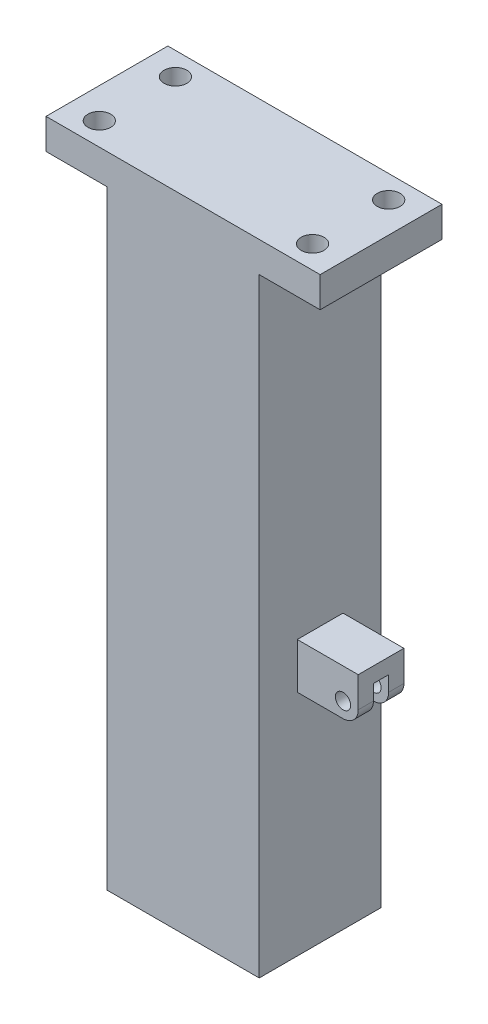
ISO-10303-21;
HEADER;
FILE_DESCRIPTION(('STEP AP214'),'2;1');
FILE_NAME('part.step','',(''),(''),'','','');
FILE_SCHEMA(('AUTOMOTIVE_DESIGN { 1 0 10303 214 1 1 1 1 }'));
ENDSEC;
DATA;
#1=APPLICATION_CONTEXT('core data for automotive mechanical design processes');
#2=APPLICATION_PROTOCOL_DEFINITION('international standard','automotive_design',2000,#1);
#3=PRODUCT_CONTEXT('',#1,'mechanical');
#4=PRODUCT('Part','Part','',(#3));
#5=PRODUCT_RELATED_PRODUCT_CATEGORY('part','',(#4));
#6=PRODUCT_DEFINITION_FORMATION('','',#4);
#7=PRODUCT_DEFINITION_CONTEXT('part definition',#1,'design');
#8=PRODUCT_DEFINITION('design','',#6,#7);
#9=PRODUCT_DEFINITION_SHAPE('','',#8);
#10=(LENGTH_UNIT() NAMED_UNIT(*) SI_UNIT(.MILLI.,.METRE.));
#11=(NAMED_UNIT(*) PLANE_ANGLE_UNIT() SI_UNIT($,.RADIAN.));
#12=(NAMED_UNIT(*) SI_UNIT($,.STERADIAN.) SOLID_ANGLE_UNIT());
#13=UNCERTAINTY_MEASURE_WITH_UNIT(LENGTH_MEASURE(1.E-05),#10,'distance_accuracy_value','');
#14=(GEOMETRIC_REPRESENTATION_CONTEXT(3) GLOBAL_UNCERTAINTY_ASSIGNED_CONTEXT((#13)) GLOBAL_UNIT_ASSIGNED_CONTEXT((#10,
#11,#12)) REPRESENTATION_CONTEXT('',''));
#15=CARTESIAN_POINT('',(0.,0.,0.));
#16=DIRECTION('',(0.,0.,1.));
#17=DIRECTION('',(1.,0.,0.));
#18=AXIS2_PLACEMENT_3D('',#15,#16,#17);
#19=CARTESIAN_POINT('',(-9.99999999999998,-240.,-55.));
#20=DIRECTION('',(0.,0.,1.));
#21=DIRECTION('',(1.,0.,0.));
#22=AXIS2_PLACEMENT_3D('',#19,#20,#21);
#23=CYLINDRICAL_SURFACE('',#22,5.);
#24=CARTESIAN_POINT('',(-9.99999999999998,-240.,-35.));
#25=DIRECTION('',(0.,0.,1.));
#26=DIRECTION('',(1.,0.,0.));
#27=AXIS2_PLACEMENT_3D('',#24,#25,#26);
#28=CIRCLE('',#27,5.);
#29=CARTESIAN_POINT('',(-4.99999999999998,-240.,-35.));
#30=VERTEX_POINT('',#29);
#31=EDGE_CURVE('E233',#30,#30,#28,.F.);
#32=ORIENTED_EDGE('',*,*,#31,.T.);
#33=EDGE_LOOP('',(#32));
#34=FACE_BOUND('',#33,.T.);
#35=CARTESIAN_POINT('',(-9.99999999999998,-240.,-25.));
#36=DIRECTION('',(0.,0.,1.));
#37=DIRECTION('',(1.,0.,0.));
#38=AXIS2_PLACEMENT_3D('',#35,#36,#37);
#39=CIRCLE('',#38,5.);
#40=CARTESIAN_POINT('',(-4.99999999999998,-240.,-25.));
#41=VERTEX_POINT('',#40);
#42=EDGE_CURVE('E229',#41,#41,#39,.T.);
#43=ORIENTED_EDGE('',*,*,#42,.T.);
#44=EDGE_LOOP('',(#43));
#45=FACE_BOUND('',#44,.T.);
#46=ADVANCED_FACE('F45',(#34,#45),#23,.F.);
#47=CARTESIAN_POINT('',(-40.,-400.,0.));
#48=DIRECTION('',(-1.,0.,0.));
#49=DIRECTION('',(0.,0.,1.));
#50=AXIS2_PLACEMENT_3D('',#47,#48,#49);
#51=PLANE('',#50);
#52=DIRECTION('',(0.,0.,1.));
#53=VECTOR('',#52,1.);
#54=CARTESIAN_POINT('',(-40.,0.,0.));
#55=LINE('',#54,#53);
#56=CARTESIAN_POINT('',(-40.,0.,-80.));
#57=VERTEX_POINT('',#56);
#58=CARTESIAN_POINT('',(-40.,0.,0.));
#59=VERTEX_POINT('',#58);
#60=EDGE_CURVE('E311',#57,#59,#55,.T.);
#61=ORIENTED_EDGE('',*,*,#60,.T.);
#62=DIRECTION('',(0.,1.,0.));
#63=VECTOR('',#62,1.);
#64=CARTESIAN_POINT('',(-40.,-400.,0.));
#65=LINE('',#64,#63);
#66=CARTESIAN_POINT('',(-40.,-400.,0.));
#67=VERTEX_POINT('',#66);
#68=EDGE_CURVE('E330',#67,#59,#65,.T.);
#69=ORIENTED_EDGE('',*,*,#68,.F.);
#70=DIRECTION('',(0.,0.,1.));
#71=VECTOR('',#70,1.);
#72=CARTESIAN_POINT('',(-40.,-400.,0.));
#73=LINE('',#72,#71);
#74=CARTESIAN_POINT('',(-40.,-400.,-80.));
#75=VERTEX_POINT('',#74);
#76=EDGE_CURVE('E314',#75,#67,#73,.T.);
#77=ORIENTED_EDGE('',*,*,#76,.F.);
#78=DIRECTION('',(0.,1.,0.));
#79=VECTOR('',#78,1.);
#80=CARTESIAN_POINT('',(-40.,-400.,-80.));
#81=LINE('',#80,#79);
#82=EDGE_CURVE('E334',#75,#57,#81,.T.);
#83=ORIENTED_EDGE('',*,*,#82,.T.);
#84=EDGE_LOOP('',(#61,#69,#77,#83));
#85=FACE_BOUND('',#84,.T.);
#86=DIRECTION('',(0.,-1.,0.));
#87=VECTOR('',#86,1.);
#88=CARTESIAN_POINT('',(-40.,-220.,-25.));
#89=LINE('',#88,#87);
#90=CARTESIAN_POINT('',(-40.,-220.,-25.));
#91=VERTEX_POINT('',#90);
#92=CARTESIAN_POINT('',(-40.,-250.,-25.));
#93=VERTEX_POINT('',#92);
#94=EDGE_CURVE('E228',#91,#93,#89,.T.);
#95=ORIENTED_EDGE('',*,*,#94,.F.);
#96=DIRECTION('',(0.,0.,1.));
#97=VECTOR('',#96,1.);
#98=CARTESIAN_POINT('',(-40.,-220.,-25.));
#99=LINE('',#98,#97);
#100=CARTESIAN_POINT('',(-40.,-220.,-55.));
#101=VERTEX_POINT('',#100);
#102=EDGE_CURVE('E239',#101,#91,#99,.T.);
#103=ORIENTED_EDGE('',*,*,#102,.F.);
#104=DIRECTION('',(0.,1.,0.));
#105=VECTOR('',#104,1.);
#106=CARTESIAN_POINT('',(-40.,-220.,-55.));
#107=LINE('',#106,#105);
#108=CARTESIAN_POINT('',(-40.,-250.,-55.));
#109=VERTEX_POINT('',#108);
#110=EDGE_CURVE('E253',#109,#101,#107,.T.);
#111=ORIENTED_EDGE('',*,*,#110,.F.);
#112=DIRECTION('',(0.,0.,-1.));
#113=VECTOR('',#112,1.);
#114=CARTESIAN_POINT('',(-40.,-250.,-25.));
#115=LINE('',#114,#113);
#116=EDGE_CURVE('E249',#93,#109,#115,.T.);
#117=ORIENTED_EDGE('',*,*,#116,.F.);
#118=EDGE_LOOP('',(#95,#103,#111,#117));
#119=FACE_BOUND('',#118,.T.);
#120=ADVANCED_FACE('F485',(#85,#119),#51,.F.);
#121=CARTESIAN_POINT('',(0.,0.,0.));
#122=DIRECTION('',(0.,1.,0.));
#123=DIRECTION('',(0.,0.,1.));
#124=AXIS2_PLACEMENT_3D('',#121,#122,#123);
#125=PLANE('',#124);
#126=CARTESIAN_POINT('',(-160.,0.,-65.));
#127=DIRECTION('',(0.,1.,0.));
#128=DIRECTION('',(0.,0.,1.));
#129=AXIS2_PLACEMENT_3D('',#126,#127,#128);
#130=CIRCLE('',#129,7.50000000000001);
#131=CARTESIAN_POINT('',(-160.,0.,-57.5));
#132=VERTEX_POINT('',#131);
#133=EDGE_CURVE('E367',#132,#132,#130,.T.);
#134=ORIENTED_EDGE('',*,*,#133,.T.);
#135=EDGE_LOOP('',(#134));
#136=FACE_BOUND('',#135,.T.);
#137=CARTESIAN_POINT('',(-160.,0.,-15.));
#138=DIRECTION('',(0.,1.,0.));
#139=DIRECTION('',(0.,0.,1.));
#140=AXIS2_PLACEMENT_3D('',#137,#138,#139);
#141=CIRCLE('',#140,7.50000000000001);
#142=CARTESIAN_POINT('',(-160.,0.,-7.49999999999997));
#143=VERTEX_POINT('',#142);
#144=EDGE_CURVE('E356',#143,#143,#141,.T.);
#145=ORIENTED_EDGE('',*,*,#144,.T.);
#146=EDGE_LOOP('',(#145));
#147=FACE_BOUND('',#146,.T.);
#148=DIRECTION('',(0.,0.,-1.));
#149=VECTOR('',#148,1.);
#150=CARTESIAN_POINT('',(-140.,0.,0.));
#151=LINE('',#150,#149);
#152=CARTESIAN_POINT('',(-140.,0.,0.));
#153=VERTEX_POINT('',#152);
#154=CARTESIAN_POINT('',(-140.,0.,-80.));
#155=VERTEX_POINT('',#154);
#156=EDGE_CURVE('E302',#153,#155,#151,.T.);
#157=ORIENTED_EDGE('',*,*,#156,.F.);
#158=DIRECTION('',(1.,0.,0.));
#159=VECTOR('',#158,1.);
#160=CARTESIAN_POINT('',(0.,0.,0.));
#161=LINE('',#160,#159);
#162=CARTESIAN_POINT('',(-180.,0.,0.));
#163=VERTEX_POINT('',#162);
#164=EDGE_CURVE('E380',#163,#153,#161,.T.);
#165=ORIENTED_EDGE('',*,*,#164,.F.);
#166=DIRECTION('',(0.,0.,1.));
#167=VECTOR('',#166,1.);
#168=CARTESIAN_POINT('',(-180.,0.,0.));
#169=LINE('',#168,#167);
#170=CARTESIAN_POINT('',(-180.,0.,-80.));
#171=VERTEX_POINT('',#170);
#172=EDGE_CURVE('E398',#171,#163,#169,.T.);
#173=ORIENTED_EDGE('',*,*,#172,.F.);
#174=DIRECTION('',(-1.,0.,0.));
#175=VECTOR('',#174,1.);
#176=CARTESIAN_POINT('',(0.,0.,-80.));
#177=LINE('',#176,#175);
#178=EDGE_CURVE('E393',#155,#171,#177,.T.);
#179=ORIENTED_EDGE('',*,*,#178,.F.);
#180=EDGE_LOOP('',(#157,#165,#173,#179));
#181=FACE_BOUND('',#180,.T.);
#182=ADVANCED_FACE('F469',(#136,#147,#181),#125,.F.);
#183=CARTESIAN_POINT('',(-20.,0.,-15.));
#184=DIRECTION('',(0.,1.,0.));
#185=DIRECTION('',(0.,0.,1.));
#186=AXIS2_PLACEMENT_3D('',#183,#184,#185);
#187=CIRCLE('',#186,7.5);
#188=CARTESIAN_POINT('',(-20.,0.,-7.49999999999999));
#189=VERTEX_POINT('',#188);
#190=EDGE_CURVE('E342',#189,#189,#187,.T.);
#191=ORIENTED_EDGE('',*,*,#190,.T.);
#192=EDGE_LOOP('',(#191));
#193=FACE_BOUND('',#192,.T.);
#194=CARTESIAN_POINT('',(-20.,0.,-65.));
#195=DIRECTION('',(0.,1.,0.));
#196=DIRECTION('',(0.,0.,1.));
#197=AXIS2_PLACEMENT_3D('',#194,#195,#196);
#198=CIRCLE('',#197,7.5);
#199=CARTESIAN_POINT('',(-20.,0.,-57.5));
#200=VERTEX_POINT('',#199);
#201=EDGE_CURVE('E347',#200,#200,#198,.T.);
#202=ORIENTED_EDGE('',*,*,#201,.T.);
#203=EDGE_LOOP('',(#202));
#204=FACE_BOUND('',#203,.T.);
#205=ORIENTED_EDGE('',*,*,#60,.F.);
#206=CARTESIAN_POINT('',(0.,0.,-80.));
#207=VERTEX_POINT('',#206);
#208=EDGE_CURVE('E394',#207,#57,#177,.T.);
#209=ORIENTED_EDGE('',*,*,#208,.F.);
#210=DIRECTION('',(0.,0.,-1.));
#211=VECTOR('',#210,1.);
#212=CARTESIAN_POINT('',(0.,0.,0.));
#213=LINE('',#212,#211);
#214=CARTESIAN_POINT('',(0.,0.,0.));
#215=VERTEX_POINT('',#214);
#216=EDGE_CURVE('E371',#215,#207,#213,.T.);
#217=ORIENTED_EDGE('',*,*,#216,.F.);
#218=EDGE_CURVE('E401',#59,#215,#161,.T.);
#219=ORIENTED_EDGE('',*,*,#218,.F.);
#220=EDGE_LOOP('',(#205,#209,#217,#219));
#221=FACE_BOUND('',#220,.T.);
#222=ADVANCED_FACE('F488',(#193,#204,#221),#125,.F.);
#223=CARTESIAN_POINT('',(0.,20.,0.));
#224=DIRECTION('',(-1.,0.,0.));
#225=DIRECTION('',(0.,0.,1.));
#226=AXIS2_PLACEMENT_3D('',#223,#224,#225);
#227=PLANE('',#226);
#228=ORIENTED_EDGE('',*,*,#216,.T.);
#229=DIRECTION('',(0.,-1.,0.));
#230=VECTOR('',#229,1.);
#231=CARTESIAN_POINT('',(0.,20.,-80.));
#232=LINE('',#231,#230);
#233=CARTESIAN_POINT('',(0.,20.,-80.));
#234=VERTEX_POINT('',#233);
#235=EDGE_CURVE('E416',#234,#207,#232,.T.);
#236=ORIENTED_EDGE('',*,*,#235,.F.);
#237=DIRECTION('',(0.,0.,-1.));
#238=VECTOR('',#237,1.);
#239=CARTESIAN_POINT('',(0.,20.,0.));
#240=LINE('',#239,#238);
#241=CARTESIAN_POINT('',(0.,20.,0.));
#242=VERTEX_POINT('',#241);
#243=EDGE_CURVE('E375',#242,#234,#240,.T.);
#244=ORIENTED_EDGE('',*,*,#243,.F.);
#245=DIRECTION('',(0.,-1.,0.));
#246=VECTOR('',#245,1.);
#247=CARTESIAN_POINT('',(0.,20.,0.));
#248=LINE('',#247,#246);
#249=EDGE_CURVE('E389',#242,#215,#248,.T.);
#250=ORIENTED_EDGE('',*,*,#249,.T.);
#251=EDGE_LOOP('',(#228,#236,#244,#250));
#252=FACE_BOUND('',#251,.T.);
#253=ADVANCED_FACE('F493',(#252),#227,.F.);
#254=CARTESIAN_POINT('',(0.,20.,-80.));
#255=DIRECTION('',(0.,0.,1.));
#256=DIRECTION('',(1.,0.,0.));
#257=AXIS2_PLACEMENT_3D('',#254,#255,#256);
#258=PLANE('',#257);
#259=ORIENTED_EDGE('',*,*,#208,.T.);
#260=ORIENTED_EDGE('',*,*,#82,.F.);
#261=DIRECTION('',(1.,0.,0.));
#262=VECTOR('',#261,1.);
#263=CARTESIAN_POINT('',(-140.,-400.,-80.));
#264=LINE('',#263,#262);
#265=CARTESIAN_POINT('',(-140.,-400.,-80.));
#266=VERTEX_POINT('',#265);
#267=EDGE_CURVE('E310',#266,#75,#264,.T.);
#268=ORIENTED_EDGE('',*,*,#267,.F.);
#269=DIRECTION('',(0.,1.,0.));
#270=VECTOR('',#269,1.);
#271=CARTESIAN_POINT('',(-140.,-400.,-80.));
#272=LINE('',#271,#270);
#273=EDGE_CURVE('E338',#266,#155,#272,.T.);
#274=ORIENTED_EDGE('',*,*,#273,.T.);
#275=ORIENTED_EDGE('',*,*,#178,.T.);
#276=DIRECTION('',(0.,-1.,0.));
#277=VECTOR('',#276,1.);
#278=CARTESIAN_POINT('',(-180.,20.,-80.));
#279=LINE('',#278,#277);
#280=CARTESIAN_POINT('',(-180.,20.,-80.));
#281=VERTEX_POINT('',#280);
#282=EDGE_CURVE('E412',#281,#171,#279,.T.);
#283=ORIENTED_EDGE('',*,*,#282,.F.);
#284=DIRECTION('',(-1.,0.,0.));
#285=VECTOR('',#284,1.);
#286=CARTESIAN_POINT('',(0.,20.,-80.));
#287=LINE('',#286,#285);
#288=EDGE_CURVE('E379',#234,#281,#287,.T.);
#289=ORIENTED_EDGE('',*,*,#288,.F.);
#290=ORIENTED_EDGE('',*,*,#235,.T.);
#291=EDGE_LOOP('',(#259,#260,#268,#274,#275,#283,#289,#290));
#292=FACE_BOUND('',#291,.T.);
#293=ADVANCED_FACE('F460',(#292),#258,.F.);
#294=CARTESIAN_POINT('',(-180.,20.,0.));
#295=DIRECTION('',(1.,0.,0.));
#296=DIRECTION('',(0.,0.,-1.));
#297=AXIS2_PLACEMENT_3D('',#294,#295,#296);
#298=PLANE('',#297);
#299=ORIENTED_EDGE('',*,*,#172,.T.);
#300=DIRECTION('',(0.,-1.,0.));
#301=VECTOR('',#300,1.);
#302=CARTESIAN_POINT('',(-180.,20.,0.));
#303=LINE('',#302,#301);
#304=CARTESIAN_POINT('',(-180.,20.,0.));
#305=VERTEX_POINT('',#304);
#306=EDGE_CURVE('E408',#305,#163,#303,.T.);
#307=ORIENTED_EDGE('',*,*,#306,.F.);
#308=DIRECTION('',(0.,0.,1.));
#309=VECTOR('',#308,1.);
#310=CARTESIAN_POINT('',(-180.,20.,0.));
#311=LINE('',#310,#309);
#312=EDGE_CURVE('E383',#281,#305,#311,.T.);
#313=ORIENTED_EDGE('',*,*,#312,.F.);
#314=ORIENTED_EDGE('',*,*,#282,.T.);
#315=EDGE_LOOP('',(#299,#307,#313,#314));
#316=FACE_BOUND('',#315,.T.);
#317=ADVANCED_FACE('F466',(#316),#298,.F.);
#318=CARTESIAN_POINT('',(0.,20.,0.));
#319=DIRECTION('',(0.,0.,-1.));
#320=DIRECTION('',(-1.,0.,0.));
#321=AXIS2_PLACEMENT_3D('',#318,#319,#320);
#322=PLANE('',#321);
#323=ORIENTED_EDGE('',*,*,#164,.T.);
#324=DIRECTION('',(0.,1.,0.));
#325=VECTOR('',#324,1.);
#326=CARTESIAN_POINT('',(-140.,-400.,0.));
#327=LINE('',#326,#325);
#328=CARTESIAN_POINT('',(-140.,-400.,0.));
#329=VERTEX_POINT('',#328);
#330=EDGE_CURVE('E320',#329,#153,#327,.T.);
#331=ORIENTED_EDGE('',*,*,#330,.F.);
#332=DIRECTION('',(-1.,0.,0.));
#333=VECTOR('',#332,1.);
#334=CARTESIAN_POINT('',(-140.,-400.,0.));
#335=LINE('',#334,#333);
#336=EDGE_CURVE('E317',#67,#329,#335,.T.);
#337=ORIENTED_EDGE('',*,*,#336,.F.);
#338=ORIENTED_EDGE('',*,*,#68,.T.);
#339=ORIENTED_EDGE('',*,*,#218,.T.);
#340=ORIENTED_EDGE('',*,*,#249,.F.);
#341=DIRECTION('',(1.,0.,0.));
#342=VECTOR('',#341,1.);
#343=CARTESIAN_POINT('',(0.,20.,0.));
#344=LINE('',#343,#342);
#345=EDGE_CURVE('E386',#305,#242,#344,.T.);
#346=ORIENTED_EDGE('',*,*,#345,.F.);
#347=ORIENTED_EDGE('',*,*,#306,.T.);
#348=EDGE_LOOP('',(#323,#331,#337,#338,#339,#340,#346,#347));
#349=FACE_BOUND('',#348,.T.);
#350=ADVANCED_FACE('F472',(#349),#322,.F.);
#351=CARTESIAN_POINT('',(0.,20.,0.));
#352=DIRECTION('',(0.,1.,0.));
#353=DIRECTION('',(0.,0.,1.));
#354=AXIS2_PLACEMENT_3D('',#351,#352,#353);
#355=PLANE('',#354);
#356=CARTESIAN_POINT('',(-160.,20.,-15.));
#357=DIRECTION('',(0.,1.,0.));
#358=DIRECTION('',(0.,0.,1.));
#359=AXIS2_PLACEMENT_3D('',#356,#357,#358);
#360=CIRCLE('',#359,7.50000000000001);
#361=CARTESIAN_POINT('',(-160.,20.,-7.49999999999997));
#362=VERTEX_POINT('',#361);
#363=EDGE_CURVE('E351',#362,#362,#360,.T.);
#364=ORIENTED_EDGE('',*,*,#363,.F.);
#365=EDGE_LOOP('',(#364));
#366=FACE_BOUND('',#365,.T.);
#367=CARTESIAN_POINT('',(-20.,20.,-65.));
#368=DIRECTION('',(0.,1.,0.));
#369=DIRECTION('',(0.,0.,1.));
#370=AXIS2_PLACEMENT_3D('',#367,#368,#369);
#371=CIRCLE('',#370,7.5);
#372=CARTESIAN_POINT('',(-20.,20.,-57.5));
#373=VERTEX_POINT('',#372);
#374=EDGE_CURVE('E360',#373,#373,#371,.T.);
#375=ORIENTED_EDGE('',*,*,#374,.F.);
#376=EDGE_LOOP('',(#375));
#377=FACE_BOUND('',#376,.T.);
#378=CARTESIAN_POINT('',(-20.,20.,-15.));
#379=DIRECTION('',(0.,1.,0.));
#380=DIRECTION('',(0.,0.,1.));
#381=AXIS2_PLACEMENT_3D('',#378,#379,#380);
#382=CIRCLE('',#381,7.5);
#383=CARTESIAN_POINT('',(-20.,20.,-7.49999999999999));
#384=VERTEX_POINT('',#383);
#385=EDGE_CURVE('E343',#384,#384,#382,.T.);
#386=ORIENTED_EDGE('',*,*,#385,.F.);
#387=EDGE_LOOP('',(#386));
#388=FACE_BOUND('',#387,.T.);
#389=CARTESIAN_POINT('',(-160.,20.,-65.));
#390=DIRECTION('',(0.,1.,0.));
#391=DIRECTION('',(0.,0.,1.));
#392=AXIS2_PLACEMENT_3D('',#389,#390,#391);
#393=CIRCLE('',#392,7.50000000000001);
#394=CARTESIAN_POINT('',(-160.,20.,-57.5));
#395=VERTEX_POINT('',#394);
#396=EDGE_CURVE('E355',#395,#395,#393,.T.);
#397=ORIENTED_EDGE('',*,*,#396,.F.);
#398=EDGE_LOOP('',(#397));
#399=FACE_BOUND('',#398,.T.);
#400=ORIENTED_EDGE('',*,*,#243,.T.);
#401=ORIENTED_EDGE('',*,*,#288,.T.);
#402=ORIENTED_EDGE('',*,*,#312,.T.);
#403=ORIENTED_EDGE('',*,*,#345,.T.);
#404=EDGE_LOOP('',(#400,#401,#402,#403));
#405=FACE_BOUND('',#404,.T.);
#406=ADVANCED_FACE('F495',(#366,#377,#388,#399,#405),#355,.T.);
#407=CARTESIAN_POINT('',(-160.,0.,-65.));
#408=DIRECTION('',(0.,1.,0.));
#409=DIRECTION('',(0.,0.,1.));
#410=AXIS2_PLACEMENT_3D('',#407,#408,#409);
#411=CYLINDRICAL_SURFACE('',#410,7.50000000000001);
#412=ORIENTED_EDGE('',*,*,#133,.F.);
#413=EDGE_LOOP('',(#412));
#414=FACE_BOUND('',#413,.T.);
#415=ORIENTED_EDGE('',*,*,#396,.T.);
#416=EDGE_LOOP('',(#415));
#417=FACE_BOUND('',#416,.T.);
#418=ADVANCED_FACE('F497',(#414,#417),#411,.F.);
#419=CARTESIAN_POINT('',(-20.,0.,-15.));
#420=DIRECTION('',(0.,1.,0.));
#421=DIRECTION('',(0.,0.,1.));
#422=AXIS2_PLACEMENT_3D('',#419,#420,#421);
#423=CYLINDRICAL_SURFACE('',#422,7.5);
#424=ORIENTED_EDGE('',*,*,#190,.F.);
#425=EDGE_LOOP('',(#424));
#426=FACE_BOUND('',#425,.T.);
#427=ORIENTED_EDGE('',*,*,#385,.T.);
#428=EDGE_LOOP('',(#427));
#429=FACE_BOUND('',#428,.T.);
#430=ADVANCED_FACE('F504',(#426,#429),#423,.F.);
#431=CARTESIAN_POINT('',(-20.,0.,-65.));
#432=DIRECTION('',(0.,1.,0.));
#433=DIRECTION('',(0.,0.,1.));
#434=AXIS2_PLACEMENT_3D('',#431,#432,#433);
#435=CYLINDRICAL_SURFACE('',#434,7.5);
#436=ORIENTED_EDGE('',*,*,#201,.F.);
#437=EDGE_LOOP('',(#436));
#438=FACE_BOUND('',#437,.T.);
#439=ORIENTED_EDGE('',*,*,#374,.T.);
#440=EDGE_LOOP('',(#439));
#441=FACE_BOUND('',#440,.T.);
#442=ADVANCED_FACE('F620',(#438,#441),#435,.F.);
#443=CARTESIAN_POINT('',(-160.,0.,-15.));
#444=DIRECTION('',(0.,1.,0.));
#445=DIRECTION('',(0.,0.,1.));
#446=AXIS2_PLACEMENT_3D('',#443,#444,#445);
#447=CYLINDRICAL_SURFACE('',#446,7.50000000000001);
#448=ORIENTED_EDGE('',*,*,#144,.F.);
#449=EDGE_LOOP('',(#448));
#450=FACE_BOUND('',#449,.T.);
#451=ORIENTED_EDGE('',*,*,#363,.T.);
#452=EDGE_LOOP('',(#451));
#453=FACE_BOUND('',#452,.T.);
#454=ADVANCED_FACE('F617',(#450,#453),#447,.F.);
#455=CARTESIAN_POINT('',(-140.,-400.,0.));
#456=DIRECTION('',(1.,0.,0.));
#457=DIRECTION('',(0.,0.,-1.));
#458=AXIS2_PLACEMENT_3D('',#455,#456,#457);
#459=PLANE('',#458);
#460=ORIENTED_EDGE('',*,*,#156,.T.);
#461=ORIENTED_EDGE('',*,*,#273,.F.);
#462=DIRECTION('',(0.,0.,-1.));
#463=VECTOR('',#462,1.);
#464=CARTESIAN_POINT('',(-140.,-400.,0.));
#465=LINE('',#464,#463);
#466=EDGE_CURVE('E306',#329,#266,#465,.T.);
#467=ORIENTED_EDGE('',*,*,#466,.F.);
#468=ORIENTED_EDGE('',*,*,#330,.T.);
#469=EDGE_LOOP('',(#460,#461,#467,#468));
#470=FACE_BOUND('',#469,.T.);
#471=ADVANCED_FACE('F477',(#470),#459,.F.);
#472=CARTESIAN_POINT('',(0.,-400.,0.));
#473=DIRECTION('',(0.,-1.,0.));
#474=DIRECTION('',(0.,0.,-1.));
#475=AXIS2_PLACEMENT_3D('',#472,#473,#474);
#476=PLANE('',#475);
#477=CARTESIAN_POINT('',(-70.,-400.,-25.));
#478=DIRECTION('',(0.,-1.,0.));
#479=DIRECTION('',(0.,0.,-1.));
#480=AXIS2_PLACEMENT_3D('',#477,#478,#479);
#481=CIRCLE('',#480,3.50000000000001);
#482=CARTESIAN_POINT('',(-70.,-400.,-28.5));
#483=VERTEX_POINT('',#482);
#484=EDGE_CURVE('E282',#483,#483,#481,.T.);
#485=ORIENTED_EDGE('',*,*,#484,.F.);
#486=EDGE_LOOP('',(#485));
#487=FACE_BOUND('',#486,.T.);
#488=CARTESIAN_POINT('',(-110.,-400.,-55.));
#489=DIRECTION('',(0.,-1.,0.));
#490=DIRECTION('',(0.,0.,-1.));
#491=AXIS2_PLACEMENT_3D('',#488,#489,#490);
#492=CIRCLE('',#491,3.50000000000001);
#493=CARTESIAN_POINT('',(-110.,-400.,-58.5));
#494=VERTEX_POINT('',#493);
#495=EDGE_CURVE('E291',#494,#494,#492,.T.);
#496=ORIENTED_EDGE('',*,*,#495,.F.);
#497=EDGE_LOOP('',(#496));
#498=FACE_BOUND('',#497,.T.);
#499=CARTESIAN_POINT('',(-70.,-400.,-55.));
#500=DIRECTION('',(0.,-1.,0.));
#501=DIRECTION('',(0.,0.,-1.));
#502=AXIS2_PLACEMENT_3D('',#499,#500,#501);
#503=CIRCLE('',#502,3.50000000000001);
#504=CARTESIAN_POINT('',(-70.,-400.,-58.5));
#505=VERTEX_POINT('',#504);
#506=EDGE_CURVE('E274',#505,#505,#503,.T.);
#507=ORIENTED_EDGE('',*,*,#506,.F.);
#508=EDGE_LOOP('',(#507));
#509=FACE_BOUND('',#508,.T.);
#510=CARTESIAN_POINT('',(-110.,-400.,-25.));
#511=DIRECTION('',(0.,-1.,0.));
#512=DIRECTION('',(0.,0.,-1.));
#513=AXIS2_PLACEMENT_3D('',#510,#511,#512);
#514=CIRCLE('',#513,3.50000000000001);
#515=CARTESIAN_POINT('',(-110.,-400.,-28.5));
#516=VERTEX_POINT('',#515);
#517=EDGE_CURVE('E286',#516,#516,#514,.T.);
#518=ORIENTED_EDGE('',*,*,#517,.F.);
#519=EDGE_LOOP('',(#518));
#520=FACE_BOUND('',#519,.T.);
#521=ORIENTED_EDGE('',*,*,#466,.T.);
#522=ORIENTED_EDGE('',*,*,#267,.T.);
#523=ORIENTED_EDGE('',*,*,#76,.T.);
#524=ORIENTED_EDGE('',*,*,#336,.T.);
#525=EDGE_LOOP('',(#521,#522,#523,#524));
#526=FACE_BOUND('',#525,.T.);
#527=ADVANCED_FACE('F479',(#487,#498,#509,#520,#526),#476,.T.);
#528=CARTESIAN_POINT('',(-110.,-390.,-25.));
#529=DIRECTION('',(0.,-1.,0.));
#530=DIRECTION('',(0.,0.,-1.));
#531=AXIS2_PLACEMENT_3D('',#528,#529,#530);
#532=CYLINDRICAL_SURFACE('',#531,3.50000000000001);
#533=CARTESIAN_POINT('',(-110.,-390.,-25.));
#534=DIRECTION('',(0.,-1.,0.));
#535=DIRECTION('',(0.,0.,-1.));
#536=AXIS2_PLACEMENT_3D('',#533,#534,#535);
#537=CIRCLE('',#536,3.50000000000001);
#538=CARTESIAN_POINT('',(-110.,-390.,-28.5));
#539=VERTEX_POINT('',#538);
#540=EDGE_CURVE('E298',#539,#539,#537,.T.);
#541=ORIENTED_EDGE('',*,*,#540,.F.);
#542=EDGE_LOOP('',(#541));
#543=FACE_BOUND('',#542,.T.);
#544=ORIENTED_EDGE('',*,*,#517,.T.);
#545=EDGE_LOOP('',(#544));
#546=FACE_BOUND('',#545,.T.);
#547=ADVANCED_FACE('F607',(#543,#546),#532,.F.);
#548=CARTESIAN_POINT('',(-110.,-390.,-25.));
#549=DIRECTION('',(0.,-1.,0.));
#550=DIRECTION('',(0.,0.,-1.));
#551=AXIS2_PLACEMENT_3D('',#548,#549,#550);
#552=PLANE('',#551);
#553=ORIENTED_EDGE('',*,*,#540,.T.);
#554=EDGE_LOOP('',(#553));
#555=FACE_BOUND('',#554,.T.);
#556=ADVANCED_FACE('F585',(#555),#552,.T.);
#557=CARTESIAN_POINT('',(-70.,-390.,-55.));
#558=DIRECTION('',(0.,-1.,0.));
#559=DIRECTION('',(0.,0.,-1.));
#560=AXIS2_PLACEMENT_3D('',#557,#558,#559);
#561=CYLINDRICAL_SURFACE('',#560,3.50000000000001);
#562=CARTESIAN_POINT('',(-70.,-390.,-55.));
#563=DIRECTION('',(0.,-1.,0.));
#564=DIRECTION('',(0.,0.,-1.));
#565=AXIS2_PLACEMENT_3D('',#562,#563,#564);
#566=CIRCLE('',#565,3.50000000000001);
#567=CARTESIAN_POINT('',(-70.,-390.,-58.5));
#568=VERTEX_POINT('',#567);
#569=EDGE_CURVE('E273',#568,#568,#566,.T.);
#570=ORIENTED_EDGE('',*,*,#569,.F.);
#571=EDGE_LOOP('',(#570));
#572=FACE_BOUND('',#571,.T.);
#573=ORIENTED_EDGE('',*,*,#506,.T.);
#574=EDGE_LOOP('',(#573));
#575=FACE_BOUND('',#574,.T.);
#576=ADVANCED_FACE('F581',(#572,#575),#561,.F.);
#577=CARTESIAN_POINT('',(-70.,-390.,-55.));
#578=DIRECTION('',(0.,-1.,0.));
#579=DIRECTION('',(0.,0.,-1.));
#580=AXIS2_PLACEMENT_3D('',#577,#578,#579);
#581=PLANE('',#580);
#582=ORIENTED_EDGE('',*,*,#569,.T.);
#583=EDGE_LOOP('',(#582));
#584=FACE_BOUND('',#583,.T.);
#585=ADVANCED_FACE('F584',(#584),#581,.T.);
#586=CARTESIAN_POINT('',(-110.,-390.,-55.));
#587=DIRECTION('',(0.,-1.,0.));
#588=DIRECTION('',(0.,0.,-1.));
#589=AXIS2_PLACEMENT_3D('',#586,#587,#588);
#590=CYLINDRICAL_SURFACE('',#589,3.50000000000001);
#591=CARTESIAN_POINT('',(-110.,-390.,-55.));
#592=DIRECTION('',(0.,-1.,0.));
#593=DIRECTION('',(0.,0.,-1.));
#594=AXIS2_PLACEMENT_3D('',#591,#592,#593);
#595=CIRCLE('',#594,3.50000000000001);
#596=CARTESIAN_POINT('',(-110.,-390.,-58.5));
#597=VERTEX_POINT('',#596);
#598=EDGE_CURVE('E278',#597,#597,#595,.T.);
#599=ORIENTED_EDGE('',*,*,#598,.F.);
#600=EDGE_LOOP('',(#599));
#601=FACE_BOUND('',#600,.T.);
#602=ORIENTED_EDGE('',*,*,#495,.T.);
#603=EDGE_LOOP('',(#602));
#604=FACE_BOUND('',#603,.T.);
#605=ADVANCED_FACE('F589',(#601,#604),#590,.F.);
#606=CARTESIAN_POINT('',(-110.,-390.,-55.));
#607=DIRECTION('',(0.,-1.,0.));
#608=DIRECTION('',(0.,0.,-1.));
#609=AXIS2_PLACEMENT_3D('',#606,#607,#608);
#610=PLANE('',#609);
#611=ORIENTED_EDGE('',*,*,#598,.T.);
#612=EDGE_LOOP('',(#611));
#613=FACE_BOUND('',#612,.T.);
#614=ADVANCED_FACE('F594',(#613),#610,.T.);
#615=CARTESIAN_POINT('',(-70.,-390.,-25.));
#616=DIRECTION('',(0.,-1.,0.));
#617=DIRECTION('',(0.,0.,-1.));
#618=AXIS2_PLACEMENT_3D('',#615,#616,#617);
#619=CYLINDRICAL_SURFACE('',#618,3.50000000000001);
#620=CARTESIAN_POINT('',(-70.,-390.,-25.));
#621=DIRECTION('',(0.,-1.,0.));
#622=DIRECTION('',(0.,0.,-1.));
#623=AXIS2_PLACEMENT_3D('',#620,#621,#622);
#624=CIRCLE('',#623,3.50000000000001);
#625=CARTESIAN_POINT('',(-70.,-390.,-28.5));
#626=VERTEX_POINT('',#625);
#627=EDGE_CURVE('E287',#626,#626,#624,.T.);
#628=ORIENTED_EDGE('',*,*,#627,.F.);
#629=EDGE_LOOP('',(#628));
#630=FACE_BOUND('',#629,.T.);
#631=ORIENTED_EDGE('',*,*,#484,.T.);
#632=EDGE_LOOP('',(#631));
#633=FACE_BOUND('',#632,.T.);
#634=ADVANCED_FACE('F591',(#630,#633),#619,.F.);
#635=CARTESIAN_POINT('',(-70.,-390.,-25.));
#636=DIRECTION('',(0.,-1.,0.));
#637=DIRECTION('',(0.,0.,-1.));
#638=AXIS2_PLACEMENT_3D('',#635,#636,#637);
#639=PLANE('',#638);
#640=ORIENTED_EDGE('',*,*,#627,.T.);
#641=EDGE_LOOP('',(#640));
#642=FACE_BOUND('',#641,.T.);
#643=ADVANCED_FACE('F579',(#642),#639,.T.);
#644=CARTESIAN_POINT('',(0.,-220.,-25.));
#645=DIRECTION('',(0.,0.,-1.));
#646=DIRECTION('',(0.,1.,0.));
#647=AXIS2_PLACEMENT_3D('',#644,#645,#646);
#648=PLANE('',#647);
#649=ORIENTED_EDGE('',*,*,#42,.F.);
#650=EDGE_LOOP('',(#649));
#651=FACE_BOUND('',#650,.T.);
#652=DIRECTION('',(-1.,0.,0.));
#653=VECTOR('',#652,1.);
#654=CARTESIAN_POINT('',(0.,-250.,-25.));
#655=LINE('',#654,#653);
#656=CARTESIAN_POINT('',(-9.99999999999998,-250.,-25.));
#657=VERTEX_POINT('',#656);
#658=EDGE_CURVE('E270',#657,#93,#655,.T.);
#659=ORIENTED_EDGE('',*,*,#658,.F.);
#660=CARTESIAN_POINT('',(-9.99999999999998,-240.,-25.));
#661=DIRECTION('',(0.,0.,-1.));
#662=DIRECTION('',(0.,1.,0.));
#663=AXIS2_PLACEMENT_3D('',#660,#661,#662);
#664=CIRCLE('',#663,10.);
#665=CARTESIAN_POINT('',(0.,-240.,-25.));
#666=VERTEX_POINT('',#665);
#667=EDGE_CURVE('E453',#657,#666,#664,.F.);
#668=ORIENTED_EDGE('',*,*,#667,.T.);
#669=DIRECTION('',(0.,-1.,0.));
#670=VECTOR('',#669,1.);
#671=CARTESIAN_POINT('',(0.,-220.,-25.));
#672=LINE('',#671,#670);
#673=CARTESIAN_POINT('',(0.,-220.,-25.));
#674=VERTEX_POINT('',#673);
#675=EDGE_CURVE('E234',#674,#666,#672,.T.);
#676=ORIENTED_EDGE('',*,*,#675,.F.);
#677=DIRECTION('',(-1.,0.,0.));
#678=VECTOR('',#677,1.);
#679=CARTESIAN_POINT('',(0.,-220.,-25.));
#680=LINE('',#679,#678);
#681=EDGE_CURVE('E245',#674,#91,#680,.T.);
#682=ORIENTED_EDGE('',*,*,#681,.T.);
#683=ORIENTED_EDGE('',*,*,#94,.T.);
#684=EDGE_LOOP('',(#659,#668,#676,#682,#683));
#685=FACE_BOUND('',#684,.T.);
#686=ADVANCED_FACE('F569',(#651,#685),#648,.F.);
#687=CARTESIAN_POINT('',(0.,-250.,-25.));
#688=DIRECTION('',(0.,1.,0.));
#689=DIRECTION('',(0.,0.,1.));
#690=AXIS2_PLACEMENT_3D('',#687,#688,#689);
#691=PLANE('',#690);
#692=DIRECTION('',(-1.,0.,0.));
#693=VECTOR('',#692,1.);
#694=CARTESIAN_POINT('',(0.,-250.,-55.));
#695=LINE('',#694,#693);
#696=CARTESIAN_POINT('',(-9.99999999999997,-250.,-55.));
#697=VERTEX_POINT('',#696);
#698=EDGE_CURVE('E267',#697,#109,#695,.T.);
#699=ORIENTED_EDGE('',*,*,#698,.F.);
#700=DIRECTION('',(0.,0.,-1.));
#701=VECTOR('',#700,1.);
#702=CARTESIAN_POINT('',(-9.99999999999998,-250.,-45.));
#703=LINE('',#702,#701);
#704=CARTESIAN_POINT('',(-9.99999999999998,-250.,-45.));
#705=VERTEX_POINT('',#704);
#706=EDGE_CURVE('E440',#697,#705,#703,.F.);
#707=ORIENTED_EDGE('',*,*,#706,.T.);
#708=DIRECTION('',(1.,0.,0.));
#709=VECTOR('',#708,1.);
#710=CARTESIAN_POINT('',(-20.,-250.,-45.));
#711=LINE('',#710,#709);
#712=CARTESIAN_POINT('',(-20.,-250.,-45.));
#713=VERTEX_POINT('',#712);
#714=EDGE_CURVE('E194',#713,#705,#711,.T.);
#715=ORIENTED_EDGE('',*,*,#714,.F.);
#716=DIRECTION('',(0.,0.,-1.));
#717=VECTOR('',#716,1.);
#718=CARTESIAN_POINT('',(-20.,-250.,-35.));
#719=LINE('',#718,#717);
#720=CARTESIAN_POINT('',(-20.,-250.,-35.));
#721=VERTEX_POINT('',#720);
#722=EDGE_CURVE('E180',#721,#713,#719,.T.);
#723=ORIENTED_EDGE('',*,*,#722,.F.);
#724=DIRECTION('',(1.,0.,0.));
#725=VECTOR('',#724,1.);
#726=CARTESIAN_POINT('',(-20.,-250.,-35.));
#727=LINE('',#726,#725);
#728=CARTESIAN_POINT('',(-9.99999999999998,-250.,-35.));
#729=VERTEX_POINT('',#728);
#730=EDGE_CURVE('E186',#721,#729,#727,.T.);
#731=ORIENTED_EDGE('',*,*,#730,.T.);
#732=DIRECTION('',(0.,0.,-1.));
#733=VECTOR('',#732,1.);
#734=CARTESIAN_POINT('',(-9.99999999999998,-250.,-25.));
#735=LINE('',#734,#733);
#736=EDGE_CURVE('E437',#729,#657,#735,.F.);
#737=ORIENTED_EDGE('',*,*,#736,.T.);
#738=ORIENTED_EDGE('',*,*,#658,.T.);
#739=ORIENTED_EDGE('',*,*,#116,.T.);
#740=EDGE_LOOP('',(#699,#707,#715,#723,#731,#737,#738,#739));
#741=FACE_BOUND('',#740,.T.);
#742=ADVANCED_FACE('F198',(#741),#691,.F.);
#743=CARTESIAN_POINT('',(0.,-220.,-55.));
#744=DIRECTION('',(0.,0.,1.));
#745=DIRECTION('',(0.,-1.,0.));
#746=AXIS2_PLACEMENT_3D('',#743,#744,#745);
#747=PLANE('',#746);
#748=CARTESIAN_POINT('',(-9.99999999999998,-240.,-55.));
#749=DIRECTION('',(0.,0.,1.));
#750=DIRECTION('',(1.,0.,0.));
#751=AXIS2_PLACEMENT_3D('',#748,#749,#750);
#752=CIRCLE('',#751,5.);
#753=CARTESIAN_POINT('',(-4.99999999999998,-240.,-55.));
#754=VERTEX_POINT('',#753);
#755=EDGE_CURVE('E224',#754,#754,#752,.T.);
#756=ORIENTED_EDGE('',*,*,#755,.T.);
#757=EDGE_LOOP('',(#756));
#758=FACE_BOUND('',#757,.T.);
#759=DIRECTION('',(0.,1.,0.));
#760=VECTOR('',#759,1.);
#761=CARTESIAN_POINT('',(0.,-220.,-55.));
#762=LINE('',#761,#760);
#763=CARTESIAN_POINT('',(0.,-240.,-55.));
#764=VERTEX_POINT('',#763);
#765=CARTESIAN_POINT('',(0.,-220.,-55.));
#766=VERTEX_POINT('',#765);
#767=EDGE_CURVE('E238',#764,#766,#762,.T.);
#768=ORIENTED_EDGE('',*,*,#767,.F.);
#769=CARTESIAN_POINT('',(-9.99999999999997,-240.,-55.));
#770=DIRECTION('',(0.,0.,1.));
#771=DIRECTION('',(0.,-1.,0.));
#772=AXIS2_PLACEMENT_3D('',#769,#770,#771);
#773=CIRCLE('',#772,10.);
#774=EDGE_CURVE('E434',#764,#697,#773,.F.);
#775=ORIENTED_EDGE('',*,*,#774,.T.);
#776=ORIENTED_EDGE('',*,*,#698,.T.);
#777=ORIENTED_EDGE('',*,*,#110,.T.);
#778=DIRECTION('',(-1.,0.,0.));
#779=VECTOR('',#778,1.);
#780=CARTESIAN_POINT('',(0.,-220.,-55.));
#781=LINE('',#780,#779);
#782=EDGE_CURVE('E263',#766,#101,#781,.T.);
#783=ORIENTED_EDGE('',*,*,#782,.F.);
#784=EDGE_LOOP('',(#768,#775,#776,#777,#783));
#785=FACE_BOUND('',#784,.T.);
#786=ADVANCED_FACE('F539',(#758,#785),#747,.F.);
#787=CARTESIAN_POINT('',(0.,-220.,-25.));
#788=DIRECTION('',(0.,-1.,0.));
#789=DIRECTION('',(0.,0.,-1.));
#790=AXIS2_PLACEMENT_3D('',#787,#788,#789);
#791=PLANE('',#790);
#792=ORIENTED_EDGE('',*,*,#102,.T.);
#793=ORIENTED_EDGE('',*,*,#681,.F.);
#794=DIRECTION('',(0.,0.,1.));
#795=VECTOR('',#794,1.);
#796=CARTESIAN_POINT('',(0.,-220.,-25.));
#797=LINE('',#796,#795);
#798=EDGE_CURVE('E242',#766,#674,#797,.T.);
#799=ORIENTED_EDGE('',*,*,#798,.F.);
#800=ORIENTED_EDGE('',*,*,#782,.T.);
#801=EDGE_LOOP('',(#792,#793,#799,#800));
#802=FACE_BOUND('',#801,.T.);
#803=ADVANCED_FACE('F533',(#802),#791,.F.);
#804=CARTESIAN_POINT('',(0.,0.,0.));
#805=DIRECTION('',(1.,0.,0.));
#806=DIRECTION('',(0.,0.,-1.));
#807=AXIS2_PLACEMENT_3D('',#804,#805,#806);
#808=PLANE('',#807);
#809=DIRECTION('',(0.,1.,0.));
#810=VECTOR('',#809,1.);
#811=CARTESIAN_POINT('',(0.,-230.,-45.));
#812=LINE('',#811,#810);
#813=CARTESIAN_POINT('',(0.,-240.,-45.));
#814=VERTEX_POINT('',#813);
#815=CARTESIAN_POINT('',(0.,-230.,-45.));
#816=VERTEX_POINT('',#815);
#817=EDGE_CURVE('E208',#814,#816,#812,.T.);
#818=ORIENTED_EDGE('',*,*,#817,.F.);
#819=DIRECTION('',(0.,0.,-1.));
#820=VECTOR('',#819,1.);
#821=CARTESIAN_POINT('',(0.,-240.,-55.));
#822=LINE('',#821,#820);
#823=EDGE_CURVE('E430',#814,#764,#822,.T.);
#824=ORIENTED_EDGE('',*,*,#823,.T.);
#825=ORIENTED_EDGE('',*,*,#767,.T.);
#826=ORIENTED_EDGE('',*,*,#798,.T.);
#827=ORIENTED_EDGE('',*,*,#675,.T.);
#828=DIRECTION('',(0.,0.,-1.));
#829=VECTOR('',#828,1.);
#830=CARTESIAN_POINT('',(0.,-240.,-35.));
#831=LINE('',#830,#829);
#832=CARTESIAN_POINT('',(0.,-240.,-35.));
#833=VERTEX_POINT('',#832);
#834=EDGE_CURVE('E420',#666,#833,#831,.T.);
#835=ORIENTED_EDGE('',*,*,#834,.T.);
#836=DIRECTION('',(0.,-1.,0.));
#837=VECTOR('',#836,1.);
#838=CARTESIAN_POINT('',(0.,-230.,-35.));
#839=LINE('',#838,#837);
#840=CARTESIAN_POINT('',(0.,-230.,-35.));
#841=VERTEX_POINT('',#840);
#842=EDGE_CURVE('E205',#841,#833,#839,.T.);
#843=ORIENTED_EDGE('',*,*,#842,.F.);
#844=DIRECTION('',(0.,0.,1.));
#845=VECTOR('',#844,1.);
#846=CARTESIAN_POINT('',(0.,-230.,-35.));
#847=LINE('',#846,#845);
#848=EDGE_CURVE('E183',#816,#841,#847,.T.);
#849=ORIENTED_EDGE('',*,*,#848,.F.);
#850=EDGE_LOOP('',(#818,#824,#825,#826,#827,#835,#843,#849));
#851=FACE_BOUND('',#850,.T.);
#852=ADVANCED_FACE('F525',(#851),#808,.T.);
#853=CARTESIAN_POINT('',(-9.99999999999998,-240.,-45.));
#854=DIRECTION('',(0.,0.,-1.));
#855=DIRECTION('',(0.,1.,0.));
#856=AXIS2_PLACEMENT_3D('',#853,#854,#855);
#857=CIRCLE('',#856,5.);
#858=CARTESIAN_POINT('',(-9.99999999999998,-235.,-45.));
#859=VERTEX_POINT('',#858);
#860=EDGE_CURVE('E218',#859,#859,#857,.F.);
#861=ORIENTED_EDGE('',*,*,#860,.T.);
#862=EDGE_LOOP('',(#861));
#863=FACE_BOUND('',#862,.T.);
#864=ORIENTED_EDGE('',*,*,#755,.F.);
#865=EDGE_LOOP('',(#864));
#866=FACE_BOUND('',#865,.T.);
#867=ADVANCED_FACE('F515',(#863,#866),#23,.F.);
#868=CARTESIAN_POINT('',(-20.,-230.,-35.));
#869=DIRECTION('',(0.,0.,1.));
#870=DIRECTION('',(1.,0.,0.));
#871=AXIS2_PLACEMENT_3D('',#868,#869,#870);
#872=PLANE('',#871);
#873=ORIENTED_EDGE('',*,*,#842,.T.);
#874=CARTESIAN_POINT('',(-9.99999999999998,-240.,-35.));
#875=DIRECTION('',(0.,0.,1.));
#876=DIRECTION('',(1.,0.,0.));
#877=AXIS2_PLACEMENT_3D('',#874,#875,#876);
#878=CIRCLE('',#877,10.);
#879=EDGE_CURVE('E190',#833,#729,#878,.F.);
#880=ORIENTED_EDGE('',*,*,#879,.T.);
#881=ORIENTED_EDGE('',*,*,#730,.F.);
#882=DIRECTION('',(0.,-1.,0.));
#883=VECTOR('',#882,1.);
#884=CARTESIAN_POINT('',(-20.,-230.,-35.));
#885=LINE('',#884,#883);
#886=CARTESIAN_POINT('',(-20.,-240.,-35.));
#887=VERTEX_POINT('',#886);
#888=EDGE_CURVE('E175',#887,#721,#885,.T.);
#889=ORIENTED_EDGE('',*,*,#888,.F.);
#890=CARTESIAN_POINT('',(-9.99999999999999,-240.,-35.));
#891=DIRECTION('',(0.,0.,1.));
#892=DIRECTION('',(1.,0.,0.));
#893=AXIS2_PLACEMENT_3D('',#890,#891,#892);
#894=CIRCLE('',#893,10.);
#895=CARTESIAN_POINT('',(-9.99999999999999,-230.,-35.));
#896=VERTEX_POINT('',#895);
#897=EDGE_CURVE('E61',#887,#896,#894,.F.);
#898=ORIENTED_EDGE('',*,*,#897,.T.);
#899=DIRECTION('',(1.,0.,0.));
#900=VECTOR('',#899,1.);
#901=CARTESIAN_POINT('',(-20.,-230.,-35.));
#902=LINE('',#901,#900);
#903=EDGE_CURVE('E215',#896,#841,#902,.T.);
#904=ORIENTED_EDGE('',*,*,#903,.T.);
#905=EDGE_LOOP('',(#873,#880,#881,#889,#898,#904));
#906=FACE_BOUND('',#905,.T.);
#907=ORIENTED_EDGE('',*,*,#31,.F.);
#908=EDGE_LOOP('',(#907));
#909=FACE_BOUND('',#908,.T.);
#910=ADVANCED_FACE('F188',(#906,#909),#872,.F.);
#911=CARTESIAN_POINT('',(-20.,-230.,-45.));
#912=DIRECTION('',(0.,0.,-1.));
#913=DIRECTION('',(0.,1.,0.));
#914=AXIS2_PLACEMENT_3D('',#911,#912,#913);
#915=PLANE('',#914);
#916=ORIENTED_EDGE('',*,*,#714,.T.);
#917=CARTESIAN_POINT('',(-9.99999999999998,-240.,-45.));
#918=DIRECTION('',(0.,0.,-1.));
#919=DIRECTION('',(0.,1.,0.));
#920=AXIS2_PLACEMENT_3D('',#917,#918,#919);
#921=CIRCLE('',#920,10.);
#922=EDGE_CURVE('E446',#705,#814,#921,.F.);
#923=ORIENTED_EDGE('',*,*,#922,.T.);
#924=ORIENTED_EDGE('',*,*,#817,.T.);
#925=DIRECTION('',(1.,0.,0.));
#926=VECTOR('',#925,1.);
#927=CARTESIAN_POINT('',(-20.,-230.,-45.));
#928=LINE('',#927,#926);
#929=CARTESIAN_POINT('',(-9.99999999999999,-230.,-45.));
#930=VERTEX_POINT('',#929);
#931=EDGE_CURVE('E219',#930,#816,#928,.T.);
#932=ORIENTED_EDGE('',*,*,#931,.F.);
#933=CARTESIAN_POINT('',(-9.99999999999999,-240.,-45.));
#934=DIRECTION('',(0.,0.,-1.));
#935=DIRECTION('',(0.,1.,0.));
#936=AXIS2_PLACEMENT_3D('',#933,#934,#935);
#937=CIRCLE('',#936,10.);
#938=CARTESIAN_POINT('',(-20.,-240.,-45.));
#939=VERTEX_POINT('',#938);
#940=EDGE_CURVE('E443',#930,#939,#937,.F.);
#941=ORIENTED_EDGE('',*,*,#940,.T.);
#942=DIRECTION('',(0.,1.,0.));
#943=VECTOR('',#942,1.);
#944=CARTESIAN_POINT('',(-20.,-230.,-45.));
#945=LINE('',#944,#943);
#946=EDGE_CURVE('E195',#713,#939,#945,.T.);
#947=ORIENTED_EDGE('',*,*,#946,.F.);
#948=EDGE_LOOP('',(#916,#923,#924,#932,#941,#947));
#949=FACE_BOUND('',#948,.T.);
#950=ORIENTED_EDGE('',*,*,#860,.F.);
#951=EDGE_LOOP('',(#950));
#952=FACE_BOUND('',#951,.T.);
#953=ADVANCED_FACE('F531',(#949,#952),#915,.F.);
#954=CARTESIAN_POINT('',(-20.,-230.,-35.));
#955=DIRECTION('',(0.,1.,0.));
#956=DIRECTION('',(-1.,0.,0.));
#957=AXIS2_PLACEMENT_3D('',#954,#955,#956);
#958=PLANE('',#957);
#959=ORIENTED_EDGE('',*,*,#903,.F.);
#960=DIRECTION('',(0.,0.,1.));
#961=VECTOR('',#960,1.);
#962=CARTESIAN_POINT('',(-9.99999999999999,-230.,-35.));
#963=LINE('',#962,#961);
#964=EDGE_CURVE('E11',#896,#930,#963,.F.);
#965=ORIENTED_EDGE('',*,*,#964,.T.);
#966=ORIENTED_EDGE('',*,*,#931,.T.);
#967=ORIENTED_EDGE('',*,*,#848,.T.);
#968=EDGE_LOOP('',(#959,#965,#966,#967));
#969=FACE_BOUND('',#968,.T.);
#970=ADVANCED_FACE('F559',(#969),#958,.F.);
#971=CARTESIAN_POINT('',(-20.,0.,0.));
#972=DIRECTION('',(1.,0.,0.));
#973=DIRECTION('',(0.,0.,-1.));
#974=AXIS2_PLACEMENT_3D('',#971,#972,#973);
#975=PLANE('',#974);
#976=ORIENTED_EDGE('',*,*,#946,.T.);
#977=DIRECTION('',(0.,0.,1.));
#978=VECTOR('',#977,1.);
#979=CARTESIAN_POINT('',(-20.,-240.,0.));
#980=LINE('',#979,#978);
#981=EDGE_CURVE('E54',#939,#887,#980,.T.);
#982=ORIENTED_EDGE('',*,*,#981,.T.);
#983=ORIENTED_EDGE('',*,*,#888,.T.);
#984=ORIENTED_EDGE('',*,*,#722,.T.);
#985=EDGE_LOOP('',(#976,#982,#983,#984));
#986=FACE_BOUND('',#985,.T.);
#987=ADVANCED_FACE('F178',(#986),#975,.T.);
#988=CARTESIAN_POINT('',(-9.99999999999999,-240.,0.));
#989=DIRECTION('',(0.,0.,1.));
#990=DIRECTION('',(1.,0.,0.));
#991=AXIS2_PLACEMENT_3D('',#988,#989,#990);
#992=CYLINDRICAL_SURFACE('',#991,10.);
#993=ORIENTED_EDGE('',*,*,#922,.F.);
#994=ORIENTED_EDGE('',*,*,#706,.F.);
#995=ORIENTED_EDGE('',*,*,#774,.F.);
#996=ORIENTED_EDGE('',*,*,#823,.F.);
#997=EDGE_LOOP('',(#993,#994,#995,#996));
#998=FACE_BOUND('',#997,.T.);
#999=ADVANCED_FACE('F552',(#998),#992,.T.);
#1000=CARTESIAN_POINT('',(-9.99999999999999,-240.,0.));
#1001=DIRECTION('',(0.,0.,1.));
#1002=DIRECTION('',(1.,0.,0.));
#1003=AXIS2_PLACEMENT_3D('',#1000,#1001,#1002);
#1004=CYLINDRICAL_SURFACE('',#1003,10.);
#1005=ORIENTED_EDGE('',*,*,#667,.F.);
#1006=ORIENTED_EDGE('',*,*,#736,.F.);
#1007=ORIENTED_EDGE('',*,*,#879,.F.);
#1008=ORIENTED_EDGE('',*,*,#834,.F.);
#1009=EDGE_LOOP('',(#1005,#1006,#1007,#1008));
#1010=FACE_BOUND('',#1009,.T.);
#1011=ADVANCED_FACE('F565',(#1010),#1004,.T.);
#1012=CARTESIAN_POINT('',(-10.,-240.,0.));
#1013=DIRECTION('',(0.,0.,1.));
#1014=DIRECTION('',(1.,0.,0.));
#1015=AXIS2_PLACEMENT_3D('',#1012,#1013,#1014);
#1016=CYLINDRICAL_SURFACE('',#1015,10.);
#1017=ORIENTED_EDGE('',*,*,#940,.F.);
#1018=ORIENTED_EDGE('',*,*,#964,.F.);
#1019=ORIENTED_EDGE('',*,*,#897,.F.);
#1020=ORIENTED_EDGE('',*,*,#981,.F.);
#1021=EDGE_LOOP('',(#1017,#1018,#1019,#1020));
#1022=FACE_BOUND('',#1021,.T.);
#1023=ADVANCED_FACE('F47',(#1022),#1016,.F.);
#1024=CLOSED_SHELL('',(#46,#120,#182,#222,#253,#293,#317,#350,#406,#418,#430,#442,#454,#471,
#527,#547,#556,#576,#585,#605,#614,#634,#643,#686,#742,#786,#803,#852,#867,#910,#953,#970,#987,
#999,#1011,#1023));
#1025=MANIFOLD_SOLID_BREP('B2',#1024);
#1026=ADVANCED_BREP_SHAPE_REPRESENTATION('',(#18,#1025),#14);
#1027=SHAPE_DEFINITION_REPRESENTATION(#9,#1026);
ENDSEC;
END-ISO-10303-21;
